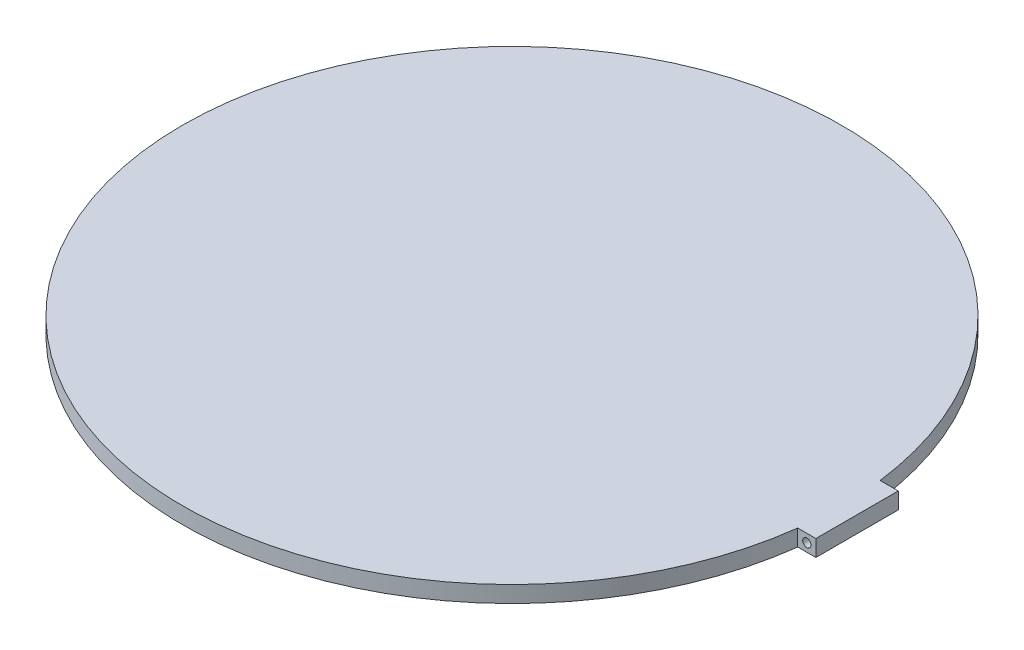
ISO-10303-21;
HEADER;
FILE_DESCRIPTION(('STEP AP214'),'2;1');
FILE_NAME('part.step','',(''),(''),'','','');
FILE_SCHEMA(('AUTOMOTIVE_DESIGN { 1 0 10303 214 1 1 1 1 }'));
ENDSEC;
DATA;
#1=APPLICATION_CONTEXT('core data for automotive mechanical design processes');
#2=APPLICATION_PROTOCOL_DEFINITION('international standard','automotive_design',2000,#1);
#3=PRODUCT_CONTEXT('',#1,'mechanical');
#4=PRODUCT('Part','Part','',(#3));
#5=PRODUCT_RELATED_PRODUCT_CATEGORY('part','',(#4));
#6=PRODUCT_DEFINITION_FORMATION('','',#4);
#7=PRODUCT_DEFINITION_CONTEXT('part definition',#1,'design');
#8=PRODUCT_DEFINITION('design','',#6,#7);
#9=PRODUCT_DEFINITION_SHAPE('','',#8);
#10=(LENGTH_UNIT() NAMED_UNIT(*) SI_UNIT(.MILLI.,.METRE.));
#11=(NAMED_UNIT(*) PLANE_ANGLE_UNIT() SI_UNIT($,.RADIAN.));
#12=(NAMED_UNIT(*) SI_UNIT($,.STERADIAN.) SOLID_ANGLE_UNIT());
#13=UNCERTAINTY_MEASURE_WITH_UNIT(LENGTH_MEASURE(1.E-05),#10,'distance_accuracy_value','');
#14=(GEOMETRIC_REPRESENTATION_CONTEXT(3) GLOBAL_UNCERTAINTY_ASSIGNED_CONTEXT((#13)) GLOBAL_UNIT_ASSIGNED_CONTEXT((#10,
#11,#12)) REPRESENTATION_CONTEXT('',''));
#15=CARTESIAN_POINT('',(0.,0.,0.));
#16=DIRECTION('',(0.,0.,1.));
#17=DIRECTION('',(1.,0.,0.));
#18=AXIS2_PLACEMENT_3D('',#15,#16,#17);
#19=CARTESIAN_POINT('',(0.,2.54,0.));
#20=DIRECTION('',(0.,0.,-1.));
#21=DIRECTION('',(-1.,0.,0.));
#22=AXIS2_PLACEMENT_3D('',#19,#20,#21);
#23=PLANE('',#22);
#24=CARTESIAN_POINT('',(-1.397,1.27,0.));
#25=DIRECTION('',(0.,0.,1.));
#26=DIRECTION('',(1.,0.,0.));
#27=AXIS2_PLACEMENT_3D('',#24,#25,#26);
#28=CIRCLE('',#27,0.635);
#29=CARTESIAN_POINT('',(-0.761999999999996,1.27,0.));
#30=VERTEX_POINT('',#29);
#31=EDGE_CURVE('E138',#30,#30,#28,.T.);
#32=ORIENTED_EDGE('',*,*,#31,.F.);
#33=EDGE_LOOP('',(#32));
#34=FACE_BOUND('',#33,.T.);
#35=DIRECTION('',(1.,0.,0.));
#36=VECTOR('',#35,1.);
#37=CARTESIAN_POINT('',(0.,0.,0.));
#38=LINE('',#37,#36);
#39=CARTESIAN_POINT('',(-2.79399999999999,0.,0.));
#40=VERTEX_POINT('',#39);
#41=CARTESIAN_POINT('',(0.,0.,0.));
#42=VERTEX_POINT('',#41);
#43=EDGE_CURVE('E118',#40,#42,#38,.T.);
#44=ORIENTED_EDGE('',*,*,#43,.T.);
#45=DIRECTION('',(0.,-1.,0.));
#46=VECTOR('',#45,1.);
#47=CARTESIAN_POINT('',(0.,2.54,0.));
#48=LINE('',#47,#46);
#49=CARTESIAN_POINT('',(0.,2.54,0.));
#50=VERTEX_POINT('',#49);
#51=EDGE_CURVE('E11',#50,#42,#48,.T.);
#52=ORIENTED_EDGE('',*,*,#51,.F.);
#53=DIRECTION('',(1.,0.,0.));
#54=VECTOR('',#53,1.);
#55=CARTESIAN_POINT('',(0.,2.54,0.));
#56=LINE('',#55,#54);
#57=CARTESIAN_POINT('',(-2.79399999999999,2.54,0.));
#58=VERTEX_POINT('',#57);
#59=EDGE_CURVE('E99',#58,#50,#56,.T.);
#60=ORIENTED_EDGE('',*,*,#59,.F.);
#61=DIRECTION('',(0.,-1.,0.));
#62=VECTOR('',#61,1.);
#63=CARTESIAN_POINT('',(-2.79399999999999,2.54,0.));
#64=LINE('',#63,#62);
#65=EDGE_CURVE('E114',#58,#40,#64,.T.);
#66=ORIENTED_EDGE('',*,*,#65,.T.);
#67=EDGE_LOOP('',(#44,#52,#60,#66));
#68=FACE_BOUND('',#67,.T.);
#69=ADVANCED_FACE('F38',(#34,#68),#23,.F.);
#70=CARTESIAN_POINT('',(0.,2.54,0.));
#71=DIRECTION('',(-1.,0.,0.));
#72=DIRECTION('',(0.,0.,1.));
#73=AXIS2_PLACEMENT_3D('',#70,#71,#72);
#74=PLANE('',#73);
#75=DIRECTION('',(0.,0.,-1.));
#76=VECTOR('',#75,1.);
#77=CARTESIAN_POINT('',(0.,0.,0.));
#78=LINE('',#77,#76);
#79=CARTESIAN_POINT('',(0.,0.,-12.7));
#80=VERTEX_POINT('',#79);
#81=EDGE_CURVE('E104',#42,#80,#78,.T.);
#82=ORIENTED_EDGE('',*,*,#81,.T.);
#83=DIRECTION('',(0.,-1.,0.));
#84=VECTOR('',#83,1.);
#85=CARTESIAN_POINT('',(0.,2.54,-12.7));
#86=LINE('',#85,#84);
#87=CARTESIAN_POINT('',(0.,2.54,-12.7));
#88=VERTEX_POINT('',#87);
#89=EDGE_CURVE('E48',#88,#80,#86,.T.);
#90=ORIENTED_EDGE('',*,*,#89,.F.);
#91=DIRECTION('',(0.,0.,-1.));
#92=VECTOR('',#91,1.);
#93=CARTESIAN_POINT('',(0.,2.54,0.));
#94=LINE('',#93,#92);
#95=EDGE_CURVE('E93',#50,#88,#94,.T.);
#96=ORIENTED_EDGE('',*,*,#95,.F.);
#97=ORIENTED_EDGE('',*,*,#51,.T.);
#98=EDGE_LOOP('',(#82,#90,#96,#97));
#99=FACE_BOUND('',#98,.T.);
#100=ADVANCED_FACE('F103',(#99),#74,.F.);
#101=CARTESIAN_POINT('',(0.,2.54,-12.7));
#102=DIRECTION('',(0.,0.,1.));
#103=DIRECTION('',(1.,0.,0.));
#104=AXIS2_PLACEMENT_3D('',#101,#102,#103);
#105=PLANE('',#104);
#106=CARTESIAN_POINT('',(-1.397,1.27,-12.7));
#107=DIRECTION('',(0.,0.,1.));
#108=DIRECTION('',(1.,0.,0.));
#109=AXIS2_PLACEMENT_3D('',#106,#107,#108);
#110=CIRCLE('',#109,0.635);
#111=CARTESIAN_POINT('',(-0.761999999999996,1.27,-12.7));
#112=VERTEX_POINT('',#111);
#113=EDGE_CURVE('E41',#112,#112,#110,.T.);
#114=ORIENTED_EDGE('',*,*,#113,.T.);
#115=EDGE_LOOP('',(#114));
#116=FACE_BOUND('',#115,.T.);
#117=DIRECTION('',(-1.,0.,0.));
#118=VECTOR('',#117,1.);
#119=CARTESIAN_POINT('',(0.,0.,-12.7));
#120=LINE('',#119,#118);
#121=CARTESIAN_POINT('',(-2.794,0.,-12.7));
#122=VERTEX_POINT('',#121);
#123=EDGE_CURVE('E80',#80,#122,#120,.T.);
#124=ORIENTED_EDGE('',*,*,#123,.T.);
#125=DIRECTION('',(0.,-1.,0.));
#126=VECTOR('',#125,1.);
#127=CARTESIAN_POINT('',(-2.794,2.54,-12.7));
#128=LINE('',#127,#126);
#129=CARTESIAN_POINT('',(-2.794,2.54,-12.7));
#130=VERTEX_POINT('',#129);
#131=EDGE_CURVE('E106',#130,#122,#128,.T.);
#132=ORIENTED_EDGE('',*,*,#131,.F.);
#133=DIRECTION('',(-1.,0.,0.));
#134=VECTOR('',#133,1.);
#135=CARTESIAN_POINT('',(0.,2.54,-12.7));
#136=LINE('',#135,#134);
#137=EDGE_CURVE('E97',#88,#130,#136,.T.);
#138=ORIENTED_EDGE('',*,*,#137,.F.);
#139=ORIENTED_EDGE('',*,*,#89,.T.);
#140=EDGE_LOOP('',(#124,#132,#138,#139));
#141=FACE_BOUND('',#140,.T.);
#142=ADVANCED_FACE('F108',(#116,#141),#105,.F.);
#143=CARTESIAN_POINT('',(-53.1955624757804,2.54,-6.35));
#144=DIRECTION('',(0.,-1.,0.));
#145=DIRECTION('',(0.,0.,-1.));
#146=AXIS2_PLACEMENT_3D('',#143,#144,#145);
#147=CYLINDRICAL_SURFACE('',#146,50.8);
#148=CARTESIAN_POINT('',(-53.1955624757804,0.,-6.35));
#149=DIRECTION('',(0.,1.,0.));
#150=DIRECTION('',(0.,0.,-1.));
#151=AXIS2_PLACEMENT_3D('',#148,#149,#150);
#152=CIRCLE('',#151,50.8);
#153=EDGE_CURVE('E86',#122,#40,#152,.T.);
#154=ORIENTED_EDGE('',*,*,#153,.T.);
#155=ORIENTED_EDGE('',*,*,#65,.F.);
#156=CARTESIAN_POINT('',(-53.1955624757804,2.54,-6.35));
#157=DIRECTION('',(0.,1.,0.));
#158=DIRECTION('',(0.,0.,-1.));
#159=AXIS2_PLACEMENT_3D('',#156,#157,#158);
#160=CIRCLE('',#159,50.8);
#161=EDGE_CURVE('E59',#130,#58,#160,.T.);
#162=ORIENTED_EDGE('',*,*,#161,.F.);
#163=ORIENTED_EDGE('',*,*,#131,.T.);
#164=EDGE_LOOP('',(#154,#155,#162,#163));
#165=FACE_BOUND('',#164,.T.);
#166=ADVANCED_FACE('F130',(#165),#147,.T.);
#167=CARTESIAN_POINT('',(-53.1955624757804,2.54,-6.35));
#168=DIRECTION('',(0.,-1.,0.));
#169=DIRECTION('',(0.,0.,-1.));
#170=AXIS2_PLACEMENT_3D('',#167,#168,#169);
#171=PLANE('',#170);
#172=ORIENTED_EDGE('',*,*,#59,.T.);
#173=ORIENTED_EDGE('',*,*,#95,.T.);
#174=ORIENTED_EDGE('',*,*,#137,.T.);
#175=ORIENTED_EDGE('',*,*,#161,.T.);
#176=EDGE_LOOP('',(#172,#173,#174,#175));
#177=FACE_BOUND('',#176,.T.);
#178=ADVANCED_FACE('F95',(#177),#171,.F.);
#179=CARTESIAN_POINT('',(-53.1955624757804,0.,-6.35));
#180=DIRECTION('',(0.,-1.,0.));
#181=DIRECTION('',(0.,0.,-1.));
#182=AXIS2_PLACEMENT_3D('',#179,#180,#181);
#183=PLANE('',#182);
#184=ORIENTED_EDGE('',*,*,#43,.F.);
#185=ORIENTED_EDGE('',*,*,#153,.F.);
#186=ORIENTED_EDGE('',*,*,#123,.F.);
#187=ORIENTED_EDGE('',*,*,#81,.F.);
#188=EDGE_LOOP('',(#184,#185,#186,#187));
#189=FACE_BOUND('',#188,.T.);
#190=ADVANCED_FACE('F133',(#189),#183,.T.);
#191=CARTESIAN_POINT('',(-1.397,1.27,-57.15));
#192=DIRECTION('',(0.,0.,1.));
#193=DIRECTION('',(1.,0.,0.));
#194=AXIS2_PLACEMENT_3D('',#191,#192,#193);
#195=CYLINDRICAL_SURFACE('',#194,0.635);
#196=ORIENTED_EDGE('',*,*,#31,.T.);
#197=EDGE_LOOP('',(#196));
#198=FACE_BOUND('',#197,.T.);
#199=ORIENTED_EDGE('',*,*,#113,.F.);
#200=EDGE_LOOP('',(#199));
#201=FACE_BOUND('',#200,.T.);
#202=ADVANCED_FACE('F146',(#198,#201),#195,.F.);
#203=CLOSED_SHELL('',(#69,#100,#142,#166,#178,#190,#202));
#204=MANIFOLD_SOLID_BREP('B2',#203);
#205=ADVANCED_BREP_SHAPE_REPRESENTATION('',(#18,#204),#14);
#206=SHAPE_DEFINITION_REPRESENTATION(#9,#205);
ENDSEC;
END-ISO-10303-21;
